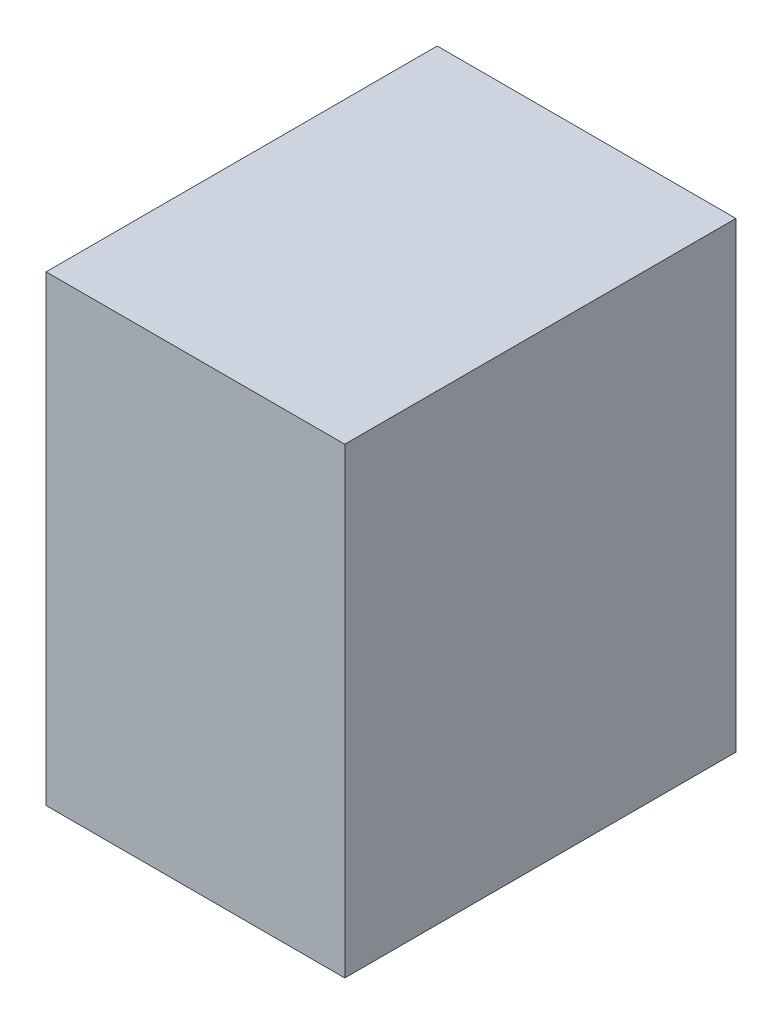
ISO-10303-21;
HEADER;
FILE_DESCRIPTION(('STEP AP214'),'2;1');
FILE_NAME('part.step','',(''),(''),'','','');
FILE_SCHEMA(('AUTOMOTIVE_DESIGN { 1 0 10303 214 1 1 1 1 }'));
ENDSEC;
DATA;
#1=APPLICATION_CONTEXT('core data for automotive mechanical design processes');
#2=APPLICATION_PROTOCOL_DEFINITION('international standard','automotive_design',2000,#1);
#3=PRODUCT_CONTEXT('',#1,'mechanical');
#4=PRODUCT('Part','Part','',(#3));
#5=PRODUCT_RELATED_PRODUCT_CATEGORY('part','',(#4));
#6=PRODUCT_DEFINITION_FORMATION('','',#4);
#7=PRODUCT_DEFINITION_CONTEXT('part definition',#1,'design');
#8=PRODUCT_DEFINITION('design','',#6,#7);
#9=PRODUCT_DEFINITION_SHAPE('','',#8);
#10=(LENGTH_UNIT() NAMED_UNIT(*) SI_UNIT(.MILLI.,.METRE.));
#11=(NAMED_UNIT(*) PLANE_ANGLE_UNIT() SI_UNIT($,.RADIAN.));
#12=(NAMED_UNIT(*) SI_UNIT($,.STERADIAN.) SOLID_ANGLE_UNIT());
#13=UNCERTAINTY_MEASURE_WITH_UNIT(LENGTH_MEASURE(1.E-05),#10,'distance_accuracy_value','');
#14=(GEOMETRIC_REPRESENTATION_CONTEXT(3) GLOBAL_UNCERTAINTY_ASSIGNED_CONTEXT((#13)) GLOBAL_UNIT_ASSIGNED_CONTEXT((#10,
#11,#12)) REPRESENTATION_CONTEXT('',''));
#15=CARTESIAN_POINT('',(0.,0.,0.));
#16=DIRECTION('',(0.,0.,1.));
#17=DIRECTION('',(1.,0.,0.));
#18=AXIS2_PLACEMENT_3D('',#15,#16,#17);
#19=CARTESIAN_POINT('',(21.,65.,27.5));
#20=DIRECTION('',(-1.,0.,0.));
#21=DIRECTION('',(0.,0.,1.));
#22=AXIS2_PLACEMENT_3D('',#19,#20,#21);
#23=PLANE('',#22);
#24=DIRECTION('',(0.,0.,-1.));
#25=VECTOR('',#24,1.);
#26=CARTESIAN_POINT('',(21.,0.,27.5));
#27=LINE('',#26,#25);
#28=CARTESIAN_POINT('',(21.,0.,27.5));
#29=VERTEX_POINT('',#28);
#30=CARTESIAN_POINT('',(21.,0.,-27.5));
#31=VERTEX_POINT('',#30);
#32=EDGE_CURVE('E98',#29,#31,#27,.T.);
#33=ORIENTED_EDGE('',*,*,#32,.T.);
#34=DIRECTION('',(0.,-1.,0.));
#35=VECTOR('',#34,1.);
#36=CARTESIAN_POINT('',(21.,65.,-27.5));
#37=LINE('',#36,#35);
#38=CARTESIAN_POINT('',(21.,65.,-27.5));
#39=VERTEX_POINT('',#38);
#40=EDGE_CURVE('E11',#39,#31,#37,.T.);
#41=ORIENTED_EDGE('',*,*,#40,.F.);
#42=DIRECTION('',(0.,0.,-1.));
#43=VECTOR('',#42,1.);
#44=CARTESIAN_POINT('',(21.,65.,27.5));
#45=LINE('',#44,#43);
#46=CARTESIAN_POINT('',(21.,65.,27.5));
#47=VERTEX_POINT('',#46);
#48=EDGE_CURVE('E86',#47,#39,#45,.T.);
#49=ORIENTED_EDGE('',*,*,#48,.F.);
#50=DIRECTION('',(0.,-1.,0.));
#51=VECTOR('',#50,1.);
#52=CARTESIAN_POINT('',(21.,65.,27.5));
#53=LINE('',#52,#51);
#54=EDGE_CURVE('E94',#47,#29,#53,.T.);
#55=ORIENTED_EDGE('',*,*,#54,.T.);
#56=EDGE_LOOP('',(#33,#41,#49,#55));
#57=FACE_BOUND('',#56,.T.);
#58=ADVANCED_FACE('F35',(#57),#23,.F.);
#59=CARTESIAN_POINT('',(-21.,65.,-27.5));
#60=DIRECTION('',(0.,0.,1.));
#61=DIRECTION('',(1.,0.,0.));
#62=AXIS2_PLACEMENT_3D('',#59,#60,#61);
#63=PLANE('',#62);
#64=DIRECTION('',(-1.,0.,0.));
#65=VECTOR('',#64,1.);
#66=CARTESIAN_POINT('',(-21.,0.,-27.5));
#67=LINE('',#66,#65);
#68=CARTESIAN_POINT('',(-21.,0.,-27.5));
#69=VERTEX_POINT('',#68);
#70=EDGE_CURVE('E90',#31,#69,#67,.T.);
#71=ORIENTED_EDGE('',*,*,#70,.T.);
#72=DIRECTION('',(0.,-1.,0.));
#73=VECTOR('',#72,1.);
#74=CARTESIAN_POINT('',(-21.,65.,-27.5));
#75=LINE('',#74,#73);
#76=CARTESIAN_POINT('',(-21.,65.,-27.5));
#77=VERTEX_POINT('',#76);
#78=EDGE_CURVE('E43',#77,#69,#75,.T.);
#79=ORIENTED_EDGE('',*,*,#78,.F.);
#80=DIRECTION('',(-1.,0.,0.));
#81=VECTOR('',#80,1.);
#82=CARTESIAN_POINT('',(-21.,65.,-27.5));
#83=LINE('',#82,#81);
#84=EDGE_CURVE('E81',#39,#77,#83,.T.);
#85=ORIENTED_EDGE('',*,*,#84,.F.);
#86=ORIENTED_EDGE('',*,*,#40,.T.);
#87=EDGE_LOOP('',(#71,#79,#85,#86));
#88=FACE_BOUND('',#87,.T.);
#89=ADVANCED_FACE('F89',(#88),#63,.F.);
#90=CARTESIAN_POINT('',(-21.,65.,27.5));
#91=DIRECTION('',(1.,0.,0.));
#92=DIRECTION('',(0.,0.,-1.));
#93=AXIS2_PLACEMENT_3D('',#90,#91,#92);
#94=PLANE('',#93);
#95=DIRECTION('',(0.,0.,1.));
#96=VECTOR('',#95,1.);
#97=CARTESIAN_POINT('',(-21.,0.,27.5));
#98=LINE('',#97,#96);
#99=CARTESIAN_POINT('',(-21.,0.,27.5));
#100=VERTEX_POINT('',#99);
#101=EDGE_CURVE('E68',#69,#100,#98,.T.);
#102=ORIENTED_EDGE('',*,*,#101,.T.);
#103=DIRECTION('',(0.,-1.,0.));
#104=VECTOR('',#103,1.);
#105=CARTESIAN_POINT('',(-21.,65.,27.5));
#106=LINE('',#105,#104);
#107=CARTESIAN_POINT('',(-21.,65.,27.5));
#108=VERTEX_POINT('',#107);
#109=EDGE_CURVE('E91',#108,#100,#106,.T.);
#110=ORIENTED_EDGE('',*,*,#109,.F.);
#111=DIRECTION('',(0.,0.,1.));
#112=VECTOR('',#111,1.);
#113=CARTESIAN_POINT('',(-21.,65.,27.5));
#114=LINE('',#113,#112);
#115=EDGE_CURVE('E84',#77,#108,#114,.T.);
#116=ORIENTED_EDGE('',*,*,#115,.F.);
#117=ORIENTED_EDGE('',*,*,#78,.T.);
#118=EDGE_LOOP('',(#102,#110,#116,#117));
#119=FACE_BOUND('',#118,.T.);
#120=ADVANCED_FACE('F92',(#119),#94,.F.);
#121=CARTESIAN_POINT('',(-21.,65.,27.5));
#122=DIRECTION('',(0.,0.,-1.));
#123=DIRECTION('',(-1.,0.,0.));
#124=AXIS2_PLACEMENT_3D('',#121,#122,#123);
#125=PLANE('',#124);
#126=DIRECTION('',(1.,0.,0.));
#127=VECTOR('',#126,1.);
#128=CARTESIAN_POINT('',(-21.,0.,27.5));
#129=LINE('',#128,#127);
#130=EDGE_CURVE('E74',#100,#29,#129,.T.);
#131=ORIENTED_EDGE('',*,*,#130,.T.);
#132=ORIENTED_EDGE('',*,*,#54,.F.);
#133=DIRECTION('',(1.,0.,0.));
#134=VECTOR('',#133,1.);
#135=CARTESIAN_POINT('',(-21.,65.,27.5));
#136=LINE('',#135,#134);
#137=EDGE_CURVE('E51',#108,#47,#136,.T.);
#138=ORIENTED_EDGE('',*,*,#137,.F.);
#139=ORIENTED_EDGE('',*,*,#109,.T.);
#140=EDGE_LOOP('',(#131,#132,#138,#139));
#141=FACE_BOUND('',#140,.T.);
#142=ADVANCED_FACE('F105',(#141),#125,.F.);
#143=CARTESIAN_POINT('',(0.,65.,0.));
#144=DIRECTION('',(0.,-1.,0.));
#145=DIRECTION('',(0.,0.,-1.));
#146=AXIS2_PLACEMENT_3D('',#143,#144,#145);
#147=PLANE('',#146);
#148=ORIENTED_EDGE('',*,*,#48,.T.);
#149=ORIENTED_EDGE('',*,*,#84,.T.);
#150=ORIENTED_EDGE('',*,*,#115,.T.);
#151=ORIENTED_EDGE('',*,*,#137,.T.);
#152=EDGE_LOOP('',(#148,#149,#150,#151));
#153=FACE_BOUND('',#152,.T.);
#154=ADVANCED_FACE('F82',(#153),#147,.F.);
#155=CARTESIAN_POINT('',(0.,0.,0.));
#156=DIRECTION('',(0.,-1.,0.));
#157=DIRECTION('',(0.,0.,-1.));
#158=AXIS2_PLACEMENT_3D('',#155,#156,#157);
#159=PLANE('',#158);
#160=ORIENTED_EDGE('',*,*,#32,.F.);
#161=ORIENTED_EDGE('',*,*,#130,.F.);
#162=ORIENTED_EDGE('',*,*,#101,.F.);
#163=ORIENTED_EDGE('',*,*,#70,.F.);
#164=EDGE_LOOP('',(#160,#161,#162,#163));
#165=FACE_BOUND('',#164,.T.);
#166=ADVANCED_FACE('F108',(#165),#159,.T.);
#167=CLOSED_SHELL('',(#58,#89,#120,#142,#154,#166));
#168=MANIFOLD_SOLID_BREP('B2',#167);
#169=ADVANCED_BREP_SHAPE_REPRESENTATION('',(#18,#168),#14);
#170=SHAPE_DEFINITION_REPRESENTATION(#9,#169);
ENDSEC;
END-ISO-10303-21;
